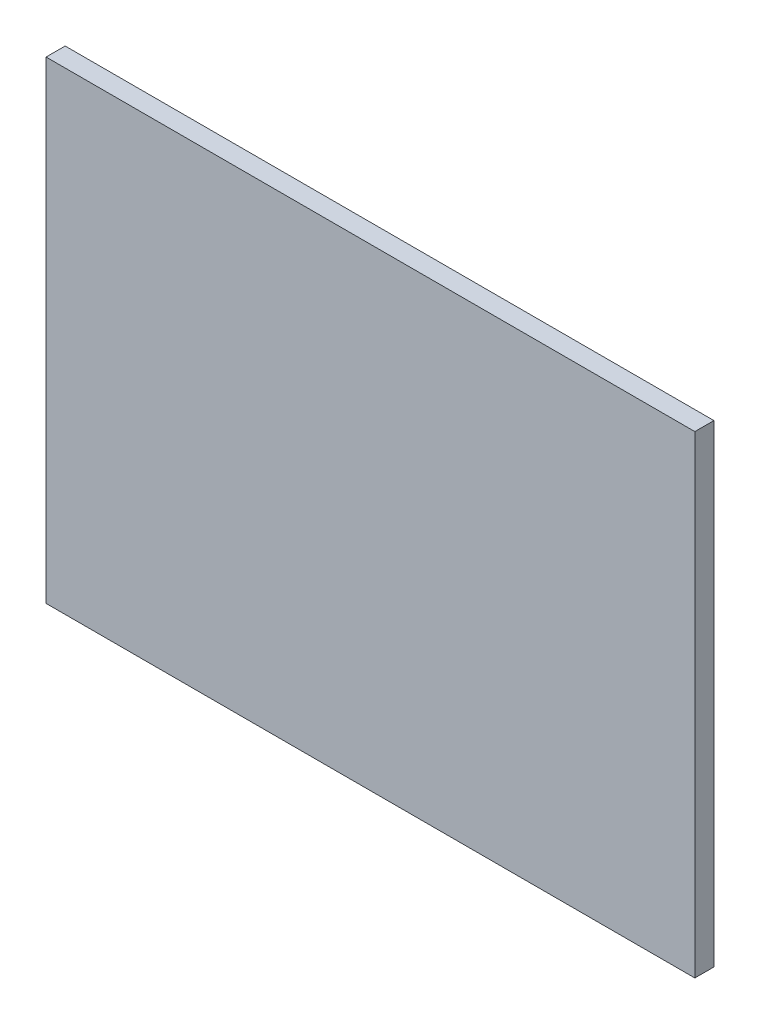
ISO-10303-21;
HEADER;
FILE_DESCRIPTION(('STEP AP214'),'2;1');
FILE_NAME('part.step','',(''),(''),'','','');
FILE_SCHEMA(('AUTOMOTIVE_DESIGN { 1 0 10303 214 1 1 1 1 }'));
ENDSEC;
DATA;
#1=APPLICATION_CONTEXT('core data for automotive mechanical design processes');
#2=APPLICATION_PROTOCOL_DEFINITION('international standard','automotive_design',2000,#1);
#3=PRODUCT_CONTEXT('',#1,'mechanical');
#4=PRODUCT('Part','Part','',(#3));
#5=PRODUCT_RELATED_PRODUCT_CATEGORY('part','',(#4));
#6=PRODUCT_DEFINITION_FORMATION('','',#4);
#7=PRODUCT_DEFINITION_CONTEXT('part definition',#1,'design');
#8=PRODUCT_DEFINITION('design','',#6,#7);
#9=PRODUCT_DEFINITION_SHAPE('','',#8);
#10=(LENGTH_UNIT() NAMED_UNIT(*) SI_UNIT(.MILLI.,.METRE.));
#11=(NAMED_UNIT(*) PLANE_ANGLE_UNIT() SI_UNIT($,.RADIAN.));
#12=(NAMED_UNIT(*) SI_UNIT($,.STERADIAN.) SOLID_ANGLE_UNIT());
#13=UNCERTAINTY_MEASURE_WITH_UNIT(LENGTH_MEASURE(1.E-05),#10,'distance_accuracy_value','');
#14=(GEOMETRIC_REPRESENTATION_CONTEXT(3) GLOBAL_UNCERTAINTY_ASSIGNED_CONTEXT((#13)) GLOBAL_UNIT_ASSIGNED_CONTEXT((#10,
#11,#12)) REPRESENTATION_CONTEXT('',''));
#15=CARTESIAN_POINT('',(0.,0.,0.));
#16=DIRECTION('',(0.,0.,1.));
#17=DIRECTION('',(1.,0.,0.));
#18=AXIS2_PLACEMENT_3D('',#15,#16,#17);
#19=CARTESIAN_POINT('',(0.,0.,5.));
#20=DIRECTION('',(1.,0.,0.));
#21=DIRECTION('',(0.,0.,-1.));
#22=AXIS2_PLACEMENT_3D('',#19,#20,#21);
#23=PLANE('',#22);
#24=DIRECTION('',(0.,-1.,0.));
#25=VECTOR('',#24,1.);
#26=CARTESIAN_POINT('',(0.,0.,0.));
#27=LINE('',#26,#25);
#28=CARTESIAN_POINT('',(0.,124.,0.));
#29=VERTEX_POINT('',#28);
#30=CARTESIAN_POINT('',(0.,0.,0.));
#31=VERTEX_POINT('',#30);
#32=EDGE_CURVE('E96',#29,#31,#27,.T.);
#33=ORIENTED_EDGE('',*,*,#32,.T.);
#34=DIRECTION('',(0.,0.,-1.));
#35=VECTOR('',#34,1.);
#36=CARTESIAN_POINT('',(0.,0.,5.));
#37=LINE('',#36,#35);
#38=CARTESIAN_POINT('',(0.,0.,5.));
#39=VERTEX_POINT('',#38);
#40=EDGE_CURVE('E11',#39,#31,#37,.T.);
#41=ORIENTED_EDGE('',*,*,#40,.F.);
#42=DIRECTION('',(0.,-1.,0.));
#43=VECTOR('',#42,1.);
#44=CARTESIAN_POINT('',(0.,0.,5.));
#45=LINE('',#44,#43);
#46=CARTESIAN_POINT('',(0.,124.,5.));
#47=VERTEX_POINT('',#46);
#48=EDGE_CURVE('E84',#47,#39,#45,.T.);
#49=ORIENTED_EDGE('',*,*,#48,.F.);
#50=DIRECTION('',(0.,0.,-1.));
#51=VECTOR('',#50,1.);
#52=CARTESIAN_POINT('',(0.,124.,5.));
#53=LINE('',#52,#51);
#54=EDGE_CURVE('E92',#47,#29,#53,.T.);
#55=ORIENTED_EDGE('',*,*,#54,.T.);
#56=EDGE_LOOP('',(#33,#41,#49,#55));
#57=FACE_BOUND('',#56,.T.);
#58=ADVANCED_FACE('F33',(#57),#23,.F.);
#59=CARTESIAN_POINT('',(0.,0.,5.));
#60=DIRECTION('',(0.,1.,0.));
#61=DIRECTION('',(0.,0.,1.));
#62=AXIS2_PLACEMENT_3D('',#59,#60,#61);
#63=PLANE('',#62);
#64=DIRECTION('',(1.,0.,0.));
#65=VECTOR('',#64,1.);
#66=CARTESIAN_POINT('',(0.,0.,0.));
#67=LINE('',#66,#65);
#68=CARTESIAN_POINT('',(170.,0.,0.));
#69=VERTEX_POINT('',#68);
#70=EDGE_CURVE('E88',#31,#69,#67,.T.);
#71=ORIENTED_EDGE('',*,*,#70,.T.);
#72=DIRECTION('',(0.,0.,-1.));
#73=VECTOR('',#72,1.);
#74=CARTESIAN_POINT('',(170.,0.,5.));
#75=LINE('',#74,#73);
#76=CARTESIAN_POINT('',(170.,0.,5.));
#77=VERTEX_POINT('',#76);
#78=EDGE_CURVE('E41',#77,#69,#75,.T.);
#79=ORIENTED_EDGE('',*,*,#78,.F.);
#80=DIRECTION('',(1.,0.,0.));
#81=VECTOR('',#80,1.);
#82=CARTESIAN_POINT('',(0.,0.,5.));
#83=LINE('',#82,#81);
#84=EDGE_CURVE('E79',#39,#77,#83,.T.);
#85=ORIENTED_EDGE('',*,*,#84,.F.);
#86=ORIENTED_EDGE('',*,*,#40,.T.);
#87=EDGE_LOOP('',(#71,#79,#85,#86));
#88=FACE_BOUND('',#87,.T.);
#89=ADVANCED_FACE('F87',(#88),#63,.F.);
#90=CARTESIAN_POINT('',(170.,0.,5.));
#91=DIRECTION('',(-1.,0.,0.));
#92=DIRECTION('',(0.,0.,1.));
#93=AXIS2_PLACEMENT_3D('',#90,#91,#92);
#94=PLANE('',#93);
#95=DIRECTION('',(0.,1.,0.));
#96=VECTOR('',#95,1.);
#97=CARTESIAN_POINT('',(170.,0.,0.));
#98=LINE('',#97,#96);
#99=CARTESIAN_POINT('',(170.,124.,0.));
#100=VERTEX_POINT('',#99);
#101=EDGE_CURVE('E66',#69,#100,#98,.T.);
#102=ORIENTED_EDGE('',*,*,#101,.T.);
#103=DIRECTION('',(0.,0.,-1.));
#104=VECTOR('',#103,1.);
#105=CARTESIAN_POINT('',(170.,124.,5.));
#106=LINE('',#105,#104);
#107=CARTESIAN_POINT('',(170.,124.,5.));
#108=VERTEX_POINT('',#107);
#109=EDGE_CURVE('E89',#108,#100,#106,.T.);
#110=ORIENTED_EDGE('',*,*,#109,.F.);
#111=DIRECTION('',(0.,1.,0.));
#112=VECTOR('',#111,1.);
#113=CARTESIAN_POINT('',(170.,0.,5.));
#114=LINE('',#113,#112);
#115=EDGE_CURVE('E82',#77,#108,#114,.T.);
#116=ORIENTED_EDGE('',*,*,#115,.F.);
#117=ORIENTED_EDGE('',*,*,#78,.T.);
#118=EDGE_LOOP('',(#102,#110,#116,#117));
#119=FACE_BOUND('',#118,.T.);
#120=ADVANCED_FACE('F90',(#119),#94,.F.);
#121=CARTESIAN_POINT('',(0.,124.,5.));
#122=DIRECTION('',(0.,-1.,0.));
#123=DIRECTION('',(0.,0.,-1.));
#124=AXIS2_PLACEMENT_3D('',#121,#122,#123);
#125=PLANE('',#124);
#126=DIRECTION('',(-1.,0.,0.));
#127=VECTOR('',#126,1.);
#128=CARTESIAN_POINT('',(0.,124.,0.));
#129=LINE('',#128,#127);
#130=EDGE_CURVE('E72',#100,#29,#129,.T.);
#131=ORIENTED_EDGE('',*,*,#130,.T.);
#132=ORIENTED_EDGE('',*,*,#54,.F.);
#133=DIRECTION('',(-1.,0.,0.));
#134=VECTOR('',#133,1.);
#135=CARTESIAN_POINT('',(0.,124.,5.));
#136=LINE('',#135,#134);
#137=EDGE_CURVE('E49',#108,#47,#136,.T.);
#138=ORIENTED_EDGE('',*,*,#137,.F.);
#139=ORIENTED_EDGE('',*,*,#109,.T.);
#140=EDGE_LOOP('',(#131,#132,#138,#139));
#141=FACE_BOUND('',#140,.T.);
#142=ADVANCED_FACE('F103',(#141),#125,.F.);
#143=CARTESIAN_POINT('',(0.,0.,5.));
#144=DIRECTION('',(0.,0.,-1.));
#145=DIRECTION('',(-1.,0.,0.));
#146=AXIS2_PLACEMENT_3D('',#143,#144,#145);
#147=PLANE('',#146);
#148=ORIENTED_EDGE('',*,*,#48,.T.);
#149=ORIENTED_EDGE('',*,*,#84,.T.);
#150=ORIENTED_EDGE('',*,*,#115,.T.);
#151=ORIENTED_EDGE('',*,*,#137,.T.);
#152=EDGE_LOOP('',(#148,#149,#150,#151));
#153=FACE_BOUND('',#152,.T.);
#154=ADVANCED_FACE('F80',(#153),#147,.F.);
#155=CARTESIAN_POINT('',(0.,0.,0.));
#156=DIRECTION('',(0.,0.,-1.));
#157=DIRECTION('',(-1.,0.,0.));
#158=AXIS2_PLACEMENT_3D('',#155,#156,#157);
#159=PLANE('',#158);
#160=ORIENTED_EDGE('',*,*,#32,.F.);
#161=ORIENTED_EDGE('',*,*,#130,.F.);
#162=ORIENTED_EDGE('',*,*,#101,.F.);
#163=ORIENTED_EDGE('',*,*,#70,.F.);
#164=EDGE_LOOP('',(#160,#161,#162,#163));
#165=FACE_BOUND('',#164,.T.);
#166=ADVANCED_FACE('F106',(#165),#159,.T.);
#167=CLOSED_SHELL('',(#58,#89,#120,#142,#154,#166));
#168=MANIFOLD_SOLID_BREP('B2',#167);
#169=ADVANCED_BREP_SHAPE_REPRESENTATION('',(#18,#168),#14);
#170=SHAPE_DEFINITION_REPRESENTATION(#9,#169);
ENDSEC;
END-ISO-10303-21;
